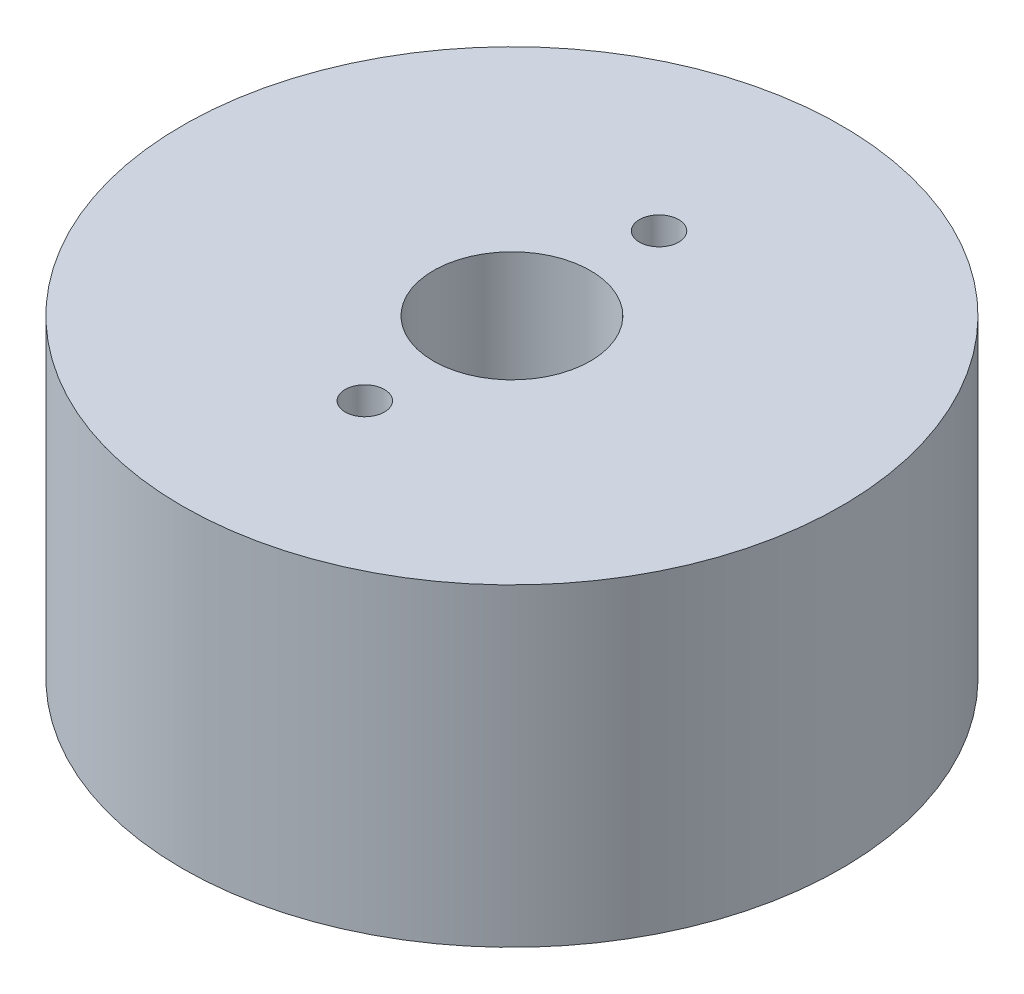
ISO-10303-21;
HEADER;
FILE_DESCRIPTION(('STEP AP214'),'2;1');
FILE_NAME('part.step','',(''),(''),'','','');
FILE_SCHEMA(('AUTOMOTIVE_DESIGN { 1 0 10303 214 1 1 1 1 }'));
ENDSEC;
DATA;
#1=APPLICATION_CONTEXT('core data for automotive mechanical design processes');
#2=APPLICATION_PROTOCOL_DEFINITION('international standard','automotive_design',2000,#1);
#3=PRODUCT_CONTEXT('',#1,'mechanical');
#4=PRODUCT('Part','Part','',(#3));
#5=PRODUCT_RELATED_PRODUCT_CATEGORY('part','',(#4));
#6=PRODUCT_DEFINITION_FORMATION('','',#4);
#7=PRODUCT_DEFINITION_CONTEXT('part definition',#1,'design');
#8=PRODUCT_DEFINITION('design','',#6,#7);
#9=PRODUCT_DEFINITION_SHAPE('','',#8);
#10=(LENGTH_UNIT() NAMED_UNIT(*) SI_UNIT(.MILLI.,.METRE.));
#11=(NAMED_UNIT(*) PLANE_ANGLE_UNIT() SI_UNIT($,.RADIAN.));
#12=(NAMED_UNIT(*) SI_UNIT($,.STERADIAN.) SOLID_ANGLE_UNIT());
#13=UNCERTAINTY_MEASURE_WITH_UNIT(LENGTH_MEASURE(1.E-05),#10,'distance_accuracy_value','');
#14=(GEOMETRIC_REPRESENTATION_CONTEXT(3) GLOBAL_UNCERTAINTY_ASSIGNED_CONTEXT((#13)) GLOBAL_UNIT_ASSIGNED_CONTEXT((#10,
#11,#12)) REPRESENTATION_CONTEXT('',''));
#15=CARTESIAN_POINT('',(0.,0.,0.));
#16=DIRECTION('',(0.,0.,1.));
#17=DIRECTION('',(1.,0.,0.));
#18=AXIS2_PLACEMENT_3D('',#15,#16,#17);
#19=CARTESIAN_POINT('',(0.,16.,0.));
#20=DIRECTION('',(0.,-1.,0.));
#21=DIRECTION('',(0.,0.,-1.));
#22=AXIS2_PLACEMENT_3D('',#19,#20,#21);
#23=CYLINDRICAL_SURFACE('',#22,16.8);
#24=CARTESIAN_POINT('',(0.,16.,0.));
#25=DIRECTION('',(0.,1.,0.));
#26=DIRECTION('',(0.,0.,1.));
#27=AXIS2_PLACEMENT_3D('',#24,#25,#26);
#28=CIRCLE('',#27,16.8);
#29=CARTESIAN_POINT('',(0.,16.,16.8));
#30=VERTEX_POINT('',#29);
#31=EDGE_CURVE('E10',#30,#30,#28,.T.);
#32=ORIENTED_EDGE('',*,*,#31,.F.);
#33=EDGE_LOOP('',(#32));
#34=FACE_BOUND('',#33,.T.);
#35=CARTESIAN_POINT('',(0.,0.,0.));
#36=DIRECTION('',(0.,1.,0.));
#37=DIRECTION('',(0.,0.,1.));
#38=AXIS2_PLACEMENT_3D('',#35,#36,#37);
#39=CIRCLE('',#38,16.8);
#40=CARTESIAN_POINT('',(0.,0.,16.8));
#41=VERTEX_POINT('',#40);
#42=EDGE_CURVE('E40',#41,#41,#39,.T.);
#43=ORIENTED_EDGE('',*,*,#42,.T.);
#44=EDGE_LOOP('',(#43));
#45=FACE_BOUND('',#44,.T.);
#46=ADVANCED_FACE('F37',(#34,#45),#23,.T.);
#47=CARTESIAN_POINT('',(0.,16.,0.));
#48=DIRECTION('',(0.,1.,0.));
#49=DIRECTION('',(0.,0.,1.));
#50=AXIS2_PLACEMENT_3D('',#47,#48,#49);
#51=PLANE('',#50);
#52=CARTESIAN_POINT('',(0.,16.,-7.5));
#53=DIRECTION('',(0.,1.,0.));
#54=DIRECTION('',(0.,0.,1.));
#55=AXIS2_PLACEMENT_3D('',#52,#53,#54);
#56=CIRCLE('',#55,1.);
#57=CARTESIAN_POINT('',(0.,16.,-6.5));
#58=VERTEX_POINT('',#57);
#59=EDGE_CURVE('E62',#58,#58,#56,.T.);
#60=ORIENTED_EDGE('',*,*,#59,.F.);
#61=EDGE_LOOP('',(#60));
#62=FACE_BOUND('',#61,.T.);
#63=CARTESIAN_POINT('',(-1.60461921527855E-13,16.,7.5));
#64=DIRECTION('',(0.,1.,0.));
#65=DIRECTION('',(0.,0.,1.));
#66=AXIS2_PLACEMENT_3D('',#63,#64,#65);
#67=CIRCLE('',#66,1.);
#68=CARTESIAN_POINT('',(-1.60461921527855E-13,16.,8.5));
#69=VERTEX_POINT('',#68);
#70=EDGE_CURVE('E55',#69,#69,#67,.T.);
#71=ORIENTED_EDGE('',*,*,#70,.F.);
#72=EDGE_LOOP('',(#71));
#73=FACE_BOUND('',#72,.T.);
#74=CARTESIAN_POINT('',(0.,16.,0.));
#75=DIRECTION('',(0.,1.,0.));
#76=DIRECTION('',(0.,0.,1.));
#77=AXIS2_PLACEMENT_3D('',#74,#75,#76);
#78=CIRCLE('',#77,4.);
#79=CARTESIAN_POINT('',(0.,16.,4.));
#80=VERTEX_POINT('',#79);
#81=EDGE_CURVE('E49',#80,#80,#78,.T.);
#82=ORIENTED_EDGE('',*,*,#81,.F.);
#83=EDGE_LOOP('',(#82));
#84=FACE_BOUND('',#83,.T.);
#85=ORIENTED_EDGE('',*,*,#31,.T.);
#86=EDGE_LOOP('',(#85));
#87=FACE_BOUND('',#86,.T.);
#88=ADVANCED_FACE('F104',(#62,#73,#84,#87),#51,.T.);
#89=CARTESIAN_POINT('',(0.,0.,0.));
#90=DIRECTION('',(0.,1.,0.));
#91=DIRECTION('',(0.,0.,1.));
#92=AXIS2_PLACEMENT_3D('',#89,#90,#91);
#93=PLANE('',#92);
#94=CARTESIAN_POINT('',(0.,0.,11.25));
#95=DIRECTION('',(0.,-1.,0.));
#96=DIRECTION('',(0.,0.,-1.));
#97=AXIS2_PLACEMENT_3D('',#94,#95,#96);
#98=CIRCLE('',#97,1.5);
#99=CARTESIAN_POINT('',(0.,0.,9.75));
#100=VERTEX_POINT('',#99);
#101=EDGE_CURVE('E85',#100,#100,#98,.T.);
#102=ORIENTED_EDGE('',*,*,#101,.F.);
#103=EDGE_LOOP('',(#102));
#104=FACE_BOUND('',#103,.T.);
#105=CARTESIAN_POINT('',(11.25,0.,0.));
#106=DIRECTION('',(0.,-1.,0.));
#107=DIRECTION('',(0.,0.,-1.));
#108=AXIS2_PLACEMENT_3D('',#105,#106,#107);
#109=CIRCLE('',#108,1.5000000000004);
#110=CARTESIAN_POINT('',(11.25,0.,-1.50000000000039));
#111=VERTEX_POINT('',#110);
#112=EDGE_CURVE('E79',#111,#111,#109,.T.);
#113=ORIENTED_EDGE('',*,*,#112,.F.);
#114=EDGE_LOOP('',(#113));
#115=FACE_BOUND('',#114,.T.);
#116=CARTESIAN_POINT('',(0.,0.,-11.25));
#117=DIRECTION('',(0.,-1.,0.));
#118=DIRECTION('',(0.,0.,-1.));
#119=AXIS2_PLACEMENT_3D('',#116,#117,#118);
#120=CIRCLE('',#119,1.50000000000061);
#121=CARTESIAN_POINT('',(0.,0.,-12.7500000000006));
#122=VERTEX_POINT('',#121);
#123=EDGE_CURVE('E73',#122,#122,#120,.T.);
#124=ORIENTED_EDGE('',*,*,#123,.F.);
#125=EDGE_LOOP('',(#124));
#126=FACE_BOUND('',#125,.T.);
#127=CARTESIAN_POINT('',(-11.25,0.,0.));
#128=DIRECTION('',(0.,-1.,0.));
#129=DIRECTION('',(0.,0.,-1.));
#130=AXIS2_PLACEMENT_3D('',#127,#128,#129);
#131=CIRCLE('',#130,1.50000000000021);
#132=CARTESIAN_POINT('',(-11.25,0.,-1.50000000000021));
#133=VERTEX_POINT('',#132);
#134=EDGE_CURVE('E67',#133,#133,#131,.T.);
#135=ORIENTED_EDGE('',*,*,#134,.F.);
#136=EDGE_LOOP('',(#135));
#137=FACE_BOUND('',#136,.T.);
#138=CARTESIAN_POINT('',(0.,0.,0.));
#139=DIRECTION('',(0.,1.,0.));
#140=DIRECTION('',(0.,0.,1.));
#141=AXIS2_PLACEMENT_3D('',#138,#139,#140);
#142=CIRCLE('',#141,4.);
#143=CARTESIAN_POINT('',(0.,0.,4.));
#144=VERTEX_POINT('',#143);
#145=EDGE_CURVE('E47',#144,#144,#142,.T.);
#146=ORIENTED_EDGE('',*,*,#145,.T.);
#147=EDGE_LOOP('',(#146));
#148=FACE_BOUND('',#147,.T.);
#149=ORIENTED_EDGE('',*,*,#42,.F.);
#150=EDGE_LOOP('',(#149));
#151=FACE_BOUND('',#150,.T.);
#152=ADVANCED_FACE('F100',(#104,#115,#126,#137,#148,#151),#93,.F.);
#153=CARTESIAN_POINT('',(0.,0.,0.));
#154=DIRECTION('',(0.,1.,0.));
#155=DIRECTION('',(0.,0.,1.));
#156=AXIS2_PLACEMENT_3D('',#153,#154,#155);
#157=CYLINDRICAL_SURFACE('',#156,4.);
#158=ORIENTED_EDGE('',*,*,#145,.F.);
#159=EDGE_LOOP('',(#158));
#160=FACE_BOUND('',#159,.T.);
#161=ORIENTED_EDGE('',*,*,#81,.T.);
#162=EDGE_LOOP('',(#161));
#163=FACE_BOUND('',#162,.T.);
#164=ADVANCED_FACE('F103',(#160,#163),#157,.F.);
#165=CARTESIAN_POINT('',(-1.60461921527855E-13,11.,7.5));
#166=DIRECTION('',(0.,1.,0.));
#167=DIRECTION('',(0.,0.,1.));
#168=AXIS2_PLACEMENT_3D('',#165,#166,#167);
#169=CYLINDRICAL_SURFACE('',#168,1.);
#170=CARTESIAN_POINT('',(-1.60461921527855E-13,11.,7.5));
#171=DIRECTION('',(0.,1.,0.));
#172=DIRECTION('',(0.,0.,1.));
#173=AXIS2_PLACEMENT_3D('',#170,#171,#172);
#174=CIRCLE('',#173,1.);
#175=CARTESIAN_POINT('',(-1.60461921527855E-13,11.,8.5));
#176=VERTEX_POINT('',#175);
#177=EDGE_CURVE('E58',#176,#176,#174,.T.);
#178=ORIENTED_EDGE('',*,*,#177,.F.);
#179=EDGE_LOOP('',(#178));
#180=FACE_BOUND('',#179,.T.);
#181=ORIENTED_EDGE('',*,*,#70,.T.);
#182=EDGE_LOOP('',(#181));
#183=FACE_BOUND('',#182,.T.);
#184=ADVANCED_FACE('F129',(#180,#183),#169,.F.);
#185=CARTESIAN_POINT('',(-1.60461921527855E-13,11.,7.5));
#186=DIRECTION('',(0.,1.,0.));
#187=DIRECTION('',(0.,0.,1.));
#188=AXIS2_PLACEMENT_3D('',#185,#186,#187);
#189=PLANE('',#188);
#190=ORIENTED_EDGE('',*,*,#177,.T.);
#191=EDGE_LOOP('',(#190));
#192=FACE_BOUND('',#191,.T.);
#193=ADVANCED_FACE('F133',(#192),#189,.T.);
#194=CARTESIAN_POINT('',(0.,11.,-7.5));
#195=DIRECTION('',(0.,1.,0.));
#196=DIRECTION('',(0.,0.,1.));
#197=AXIS2_PLACEMENT_3D('',#194,#195,#196);
#198=CYLINDRICAL_SURFACE('',#197,1.);
#199=CARTESIAN_POINT('',(0.,11.,-7.5));
#200=DIRECTION('',(0.,1.,0.));
#201=DIRECTION('',(0.,0.,1.));
#202=AXIS2_PLACEMENT_3D('',#199,#200,#201);
#203=CIRCLE('',#202,1.);
#204=CARTESIAN_POINT('',(0.,11.,-6.5));
#205=VERTEX_POINT('',#204);
#206=EDGE_CURVE('E52',#205,#205,#203,.T.);
#207=ORIENTED_EDGE('',*,*,#206,.F.);
#208=EDGE_LOOP('',(#207));
#209=FACE_BOUND('',#208,.T.);
#210=ORIENTED_EDGE('',*,*,#59,.T.);
#211=EDGE_LOOP('',(#210));
#212=FACE_BOUND('',#211,.T.);
#213=ADVANCED_FACE('F137',(#209,#212),#198,.F.);
#214=CARTESIAN_POINT('',(0.,11.,-7.5));
#215=DIRECTION('',(0.,1.,0.));
#216=DIRECTION('',(0.,0.,1.));
#217=AXIS2_PLACEMENT_3D('',#214,#215,#216);
#218=PLANE('',#217);
#219=ORIENTED_EDGE('',*,*,#206,.T.);
#220=EDGE_LOOP('',(#219));
#221=FACE_BOUND('',#220,.T.);
#222=ADVANCED_FACE('F141',(#221),#218,.T.);
#223=CARTESIAN_POINT('',(-11.25,5.,0.));
#224=DIRECTION('',(0.,-1.,0.));
#225=DIRECTION('',(0.,0.,-1.));
#226=AXIS2_PLACEMENT_3D('',#223,#224,#225);
#227=CYLINDRICAL_SURFACE('',#226,1.50000000000021);
#228=CARTESIAN_POINT('',(-11.25,5.,0.));
#229=DIRECTION('',(0.,-1.,0.));
#230=DIRECTION('',(0.,0.,-1.));
#231=AXIS2_PLACEMENT_3D('',#228,#229,#230);
#232=CIRCLE('',#231,1.50000000000021);
#233=CARTESIAN_POINT('',(-11.25,5.,-1.50000000000021));
#234=VERTEX_POINT('',#233);
#235=EDGE_CURVE('E70',#234,#234,#232,.T.);
#236=ORIENTED_EDGE('',*,*,#235,.F.);
#237=EDGE_LOOP('',(#236));
#238=FACE_BOUND('',#237,.T.);
#239=ORIENTED_EDGE('',*,*,#134,.T.);
#240=EDGE_LOOP('',(#239));
#241=FACE_BOUND('',#240,.T.);
#242=ADVANCED_FACE('F145',(#238,#241),#227,.F.);
#243=CARTESIAN_POINT('',(-11.25,5.,0.));
#244=DIRECTION('',(0.,-1.,0.));
#245=DIRECTION('',(0.,0.,-1.));
#246=AXIS2_PLACEMENT_3D('',#243,#244,#245);
#247=PLANE('',#246);
#248=ORIENTED_EDGE('',*,*,#235,.T.);
#249=EDGE_LOOP('',(#248));
#250=FACE_BOUND('',#249,.T.);
#251=ADVANCED_FACE('F149',(#250),#247,.T.);
#252=CARTESIAN_POINT('',(0.,5.,-11.25));
#253=DIRECTION('',(0.,-1.,0.));
#254=DIRECTION('',(0.,0.,-1.));
#255=AXIS2_PLACEMENT_3D('',#252,#253,#254);
#256=CYLINDRICAL_SURFACE('',#255,1.50000000000061);
#257=CARTESIAN_POINT('',(0.,5.,-11.25));
#258=DIRECTION('',(0.,-1.,0.));
#259=DIRECTION('',(0.,0.,-1.));
#260=AXIS2_PLACEMENT_3D('',#257,#258,#259);
#261=CIRCLE('',#260,1.50000000000061);
#262=CARTESIAN_POINT('',(0.,5.,-12.7500000000006));
#263=VERTEX_POINT('',#262);
#264=EDGE_CURVE('E76',#263,#263,#261,.T.);
#265=ORIENTED_EDGE('',*,*,#264,.F.);
#266=EDGE_LOOP('',(#265));
#267=FACE_BOUND('',#266,.T.);
#268=ORIENTED_EDGE('',*,*,#123,.T.);
#269=EDGE_LOOP('',(#268));
#270=FACE_BOUND('',#269,.T.);
#271=ADVANCED_FACE('F153',(#267,#270),#256,.F.);
#272=CARTESIAN_POINT('',(0.,5.,-11.25));
#273=DIRECTION('',(0.,-1.,0.));
#274=DIRECTION('',(0.,0.,-1.));
#275=AXIS2_PLACEMENT_3D('',#272,#273,#274);
#276=PLANE('',#275);
#277=ORIENTED_EDGE('',*,*,#264,.T.);
#278=EDGE_LOOP('',(#277));
#279=FACE_BOUND('',#278,.T.);
#280=ADVANCED_FACE('F157',(#279),#276,.T.);
#281=CARTESIAN_POINT('',(11.25,5.,0.));
#282=DIRECTION('',(0.,-1.,0.));
#283=DIRECTION('',(0.,0.,-1.));
#284=AXIS2_PLACEMENT_3D('',#281,#282,#283);
#285=CYLINDRICAL_SURFACE('',#284,1.5000000000004);
#286=CARTESIAN_POINT('',(11.25,5.,0.));
#287=DIRECTION('',(0.,-1.,0.));
#288=DIRECTION('',(0.,0.,-1.));
#289=AXIS2_PLACEMENT_3D('',#286,#287,#288);
#290=CIRCLE('',#289,1.5000000000004);
#291=CARTESIAN_POINT('',(11.25,5.,-1.50000000000039));
#292=VERTEX_POINT('',#291);
#293=EDGE_CURVE('E82',#292,#292,#290,.T.);
#294=ORIENTED_EDGE('',*,*,#293,.F.);
#295=EDGE_LOOP('',(#294));
#296=FACE_BOUND('',#295,.T.);
#297=ORIENTED_EDGE('',*,*,#112,.T.);
#298=EDGE_LOOP('',(#297));
#299=FACE_BOUND('',#298,.T.);
#300=ADVANCED_FACE('F161',(#296,#299),#285,.F.);
#301=CARTESIAN_POINT('',(11.25,5.,0.));
#302=DIRECTION('',(0.,-1.,0.));
#303=DIRECTION('',(0.,0.,-1.));
#304=AXIS2_PLACEMENT_3D('',#301,#302,#303);
#305=PLANE('',#304);
#306=ORIENTED_EDGE('',*,*,#293,.T.);
#307=EDGE_LOOP('',(#306));
#308=FACE_BOUND('',#307,.T.);
#309=ADVANCED_FACE('F96',(#308),#305,.T.);
#310=CARTESIAN_POINT('',(0.,5.,11.25));
#311=DIRECTION('',(0.,-1.,0.));
#312=DIRECTION('',(0.,0.,-1.));
#313=AXIS2_PLACEMENT_3D('',#310,#311,#312);
#314=CYLINDRICAL_SURFACE('',#313,1.5);
#315=CARTESIAN_POINT('',(0.,5.,11.25));
#316=DIRECTION('',(0.,-1.,0.));
#317=DIRECTION('',(0.,0.,-1.));
#318=AXIS2_PLACEMENT_3D('',#315,#316,#317);
#319=CIRCLE('',#318,1.5);
#320=CARTESIAN_POINT('',(0.,5.,9.75));
#321=VERTEX_POINT('',#320);
#322=EDGE_CURVE('E59',#321,#321,#319,.T.);
#323=ORIENTED_EDGE('',*,*,#322,.F.);
#324=EDGE_LOOP('',(#323));
#325=FACE_BOUND('',#324,.T.);
#326=ORIENTED_EDGE('',*,*,#101,.T.);
#327=EDGE_LOOP('',(#326));
#328=FACE_BOUND('',#327,.T.);
#329=ADVANCED_FACE('F93',(#325,#328),#314,.F.);
#330=CARTESIAN_POINT('',(0.,5.,11.25));
#331=DIRECTION('',(0.,-1.,0.));
#332=DIRECTION('',(0.,0.,-1.));
#333=AXIS2_PLACEMENT_3D('',#330,#331,#332);
#334=PLANE('',#333);
#335=ORIENTED_EDGE('',*,*,#322,.T.);
#336=EDGE_LOOP('',(#335));
#337=FACE_BOUND('',#336,.T.);
#338=ADVANCED_FACE('F91',(#337),#334,.T.);
#339=CLOSED_SHELL('',(#46,#88,#152,#164,#184,#193,#213,#222,#242,#251,#271,#280,#300,#309,#329,#338));
#340=MANIFOLD_SOLID_BREP('B2',#339);
#341=ADVANCED_BREP_SHAPE_REPRESENTATION('',(#18,#340),#14);
#342=SHAPE_DEFINITION_REPRESENTATION(#9,#341);
ENDSEC;
END-ISO-10303-21;
